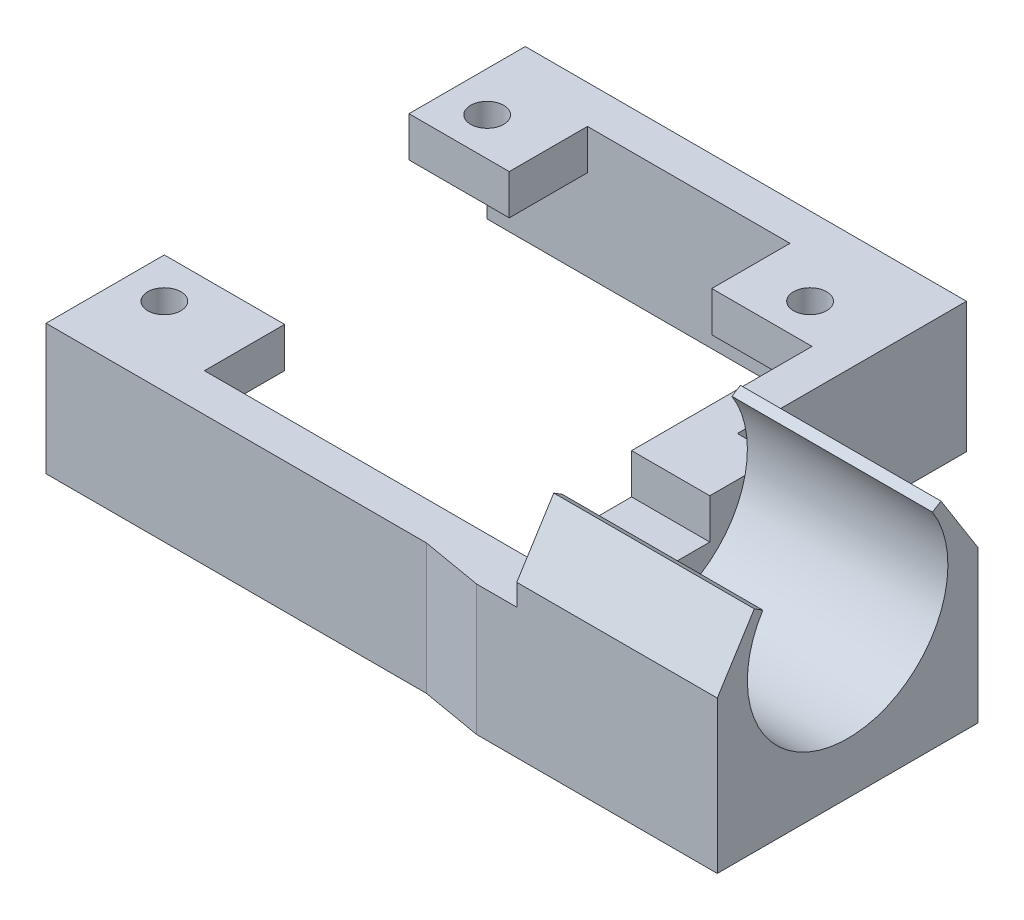
ISO-10303-21;
HEADER;
FILE_DESCRIPTION(('STEP AP214'),'2;1');
FILE_NAME('part.step','',(''),(''),'','','');
FILE_SCHEMA(('AUTOMOTIVE_DESIGN { 1 0 10303 214 1 1 1 1 }'));
ENDSEC;
DATA;
#1=APPLICATION_CONTEXT('core data for automotive mechanical design processes');
#2=APPLICATION_PROTOCOL_DEFINITION('international standard','automotive_design',2000,#1);
#3=PRODUCT_CONTEXT('',#1,'mechanical');
#4=PRODUCT('Part','Part','',(#3));
#5=PRODUCT_RELATED_PRODUCT_CATEGORY('part','',(#4));
#6=PRODUCT_DEFINITION_FORMATION('','',#4);
#7=PRODUCT_DEFINITION_CONTEXT('part definition',#1,'design');
#8=PRODUCT_DEFINITION('design','',#6,#7);
#9=PRODUCT_DEFINITION_SHAPE('','',#8);
#10=(LENGTH_UNIT() NAMED_UNIT(*) SI_UNIT(.MILLI.,.METRE.));
#11=(NAMED_UNIT(*) PLANE_ANGLE_UNIT() SI_UNIT($,.RADIAN.));
#12=(NAMED_UNIT(*) SI_UNIT($,.STERADIAN.) SOLID_ANGLE_UNIT());
#13=UNCERTAINTY_MEASURE_WITH_UNIT(LENGTH_MEASURE(1.E-05),#10,'distance_accuracy_value','');
#14=(GEOMETRIC_REPRESENTATION_CONTEXT(3) GLOBAL_UNCERTAINTY_ASSIGNED_CONTEXT((#13)) GLOBAL_UNIT_ASSIGNED_CONTEXT((#10,
#11,#12)) REPRESENTATION_CONTEXT('',''));
#15=CARTESIAN_POINT('',(0.,0.,0.));
#16=DIRECTION('',(0.,0.,1.));
#17=DIRECTION('',(1.,0.,0.));
#18=AXIS2_PLACEMENT_3D('',#15,#16,#17);
#19=CARTESIAN_POINT('',(27.9,15.15,11.95));
#20=DIRECTION('',(1.,0.,0.));
#21=DIRECTION('',(0.,0.,-1.));
#22=AXIS2_PLACEMENT_3D('',#19,#20,#21);
#23=PLANE('',#22);
#24=DIRECTION('',(0.,0.,1.));
#25=VECTOR('',#24,1.);
#26=CARTESIAN_POINT('',(27.9,9.,-1.05));
#27=LINE('',#26,#25);
#28=CARTESIAN_POINT('',(27.9,8.99999999999999,19.8352710796776));
#29=VERTEX_POINT('',#28);
#30=CARTESIAN_POINT('',(27.9,8.99999999999999,20.1));
#31=VERTEX_POINT('',#30);
#32=EDGE_CURVE('E550',#29,#31,#27,.T.);
#33=ORIENTED_EDGE('',*,*,#32,.T.);
#34=DIRECTION('',(0.,-1.,0.));
#35=VECTOR('',#34,1.);
#36=CARTESIAN_POINT('',(27.9,13.,20.1));
#37=LINE('',#36,#35);
#38=CARTESIAN_POINT('',(27.9,9.35539043593099,20.1));
#39=VERTEX_POINT('',#38);
#40=EDGE_CURVE('E337',#39,#31,#37,.T.);
#41=ORIENTED_EDGE('',*,*,#40,.F.);
#42=CARTESIAN_POINT('',(27.9,15.15,11.95));
#43=DIRECTION('',(1.,0.,0.));
#44=DIRECTION('',(0.,0.,-1.));
#45=AXIS2_PLACEMENT_3D('',#42,#43,#44);
#46=CIRCLE('',#45,10.);
#47=EDGE_CURVE('E523',#39,#29,#46,.T.);
#48=ORIENTED_EDGE('',*,*,#47,.T.);
#49=EDGE_LOOP('',(#33,#41,#48));
#50=FACE_BOUND('',#49,.T.);
#51=ADVANCED_FACE('F41',(#50),#23,.F.);
#52=CARTESIAN_POINT('',(27.9,0.,0.));
#53=DIRECTION('',(1.,0.,0.));
#54=DIRECTION('',(0.,0.,-1.));
#55=AXIS2_PLACEMENT_3D('',#52,#53,#54);
#56=PLANE('',#55);
#57=CARTESIAN_POINT('',(27.9,13.,2.18385951360518));
#58=VERTEX_POINT('',#57);
#59=EDGE_CURVE('E11',#29,#58,#46,.T.);
#60=ORIENTED_EDGE('',*,*,#59,.T.);
#61=DIRECTION('',(0.,0.,-1.));
#62=VECTOR('',#61,1.);
#63=CARTESIAN_POINT('',(27.9,13.,0.));
#64=LINE('',#63,#62);
#65=CARTESIAN_POINT('',(27.9,13.,5.70000000000001));
#66=VERTEX_POINT('',#65);
#67=EDGE_CURVE('E373',#66,#58,#64,.T.);
#68=ORIENTED_EDGE('',*,*,#67,.F.);
#69=DIRECTION('',(0.,-1.,0.));
#70=VECTOR('',#69,1.);
#71=CARTESIAN_POINT('',(27.9,13.,5.70000000000001));
#72=LINE('',#71,#70);
#73=CARTESIAN_POINT('',(27.9,9.,5.70000000000001));
#74=VERTEX_POINT('',#73);
#75=EDGE_CURVE('E435',#66,#74,#72,.T.);
#76=ORIENTED_EDGE('',*,*,#75,.T.);
#77=EDGE_CURVE('E545',#74,#29,#27,.T.);
#78=ORIENTED_EDGE('',*,*,#77,.T.);
#79=EDGE_LOOP('',(#60,#68,#76,#78));
#80=FACE_BOUND('',#79,.T.);
#81=ADVANCED_FACE('F678',(#80),#56,.T.);
#82=CARTESIAN_POINT('',(23.9,9.,-23.9));
#83=DIRECTION('',(-1.,0.,0.));
#84=DIRECTION('',(0.,0.,1.));
#85=AXIS2_PLACEMENT_3D('',#82,#83,#84);
#86=PLANE('',#85);
#87=DIRECTION('',(0.,1.,0.));
#88=VECTOR('',#87,1.);
#89=CARTESIAN_POINT('',(23.9,0.,-1.05));
#90=LINE('',#89,#88);
#91=CARTESIAN_POINT('',(23.9,0.,-1.05000000000001));
#92=VERTEX_POINT('',#91);
#93=CARTESIAN_POINT('',(23.9,13.,-1.05000000000001));
#94=VERTEX_POINT('',#93);
#95=EDGE_CURVE('E544',#92,#94,#90,.T.);
#96=ORIENTED_EDGE('',*,*,#95,.F.);
#97=DIRECTION('',(0.,0.,-1.));
#98=VECTOR('',#97,1.);
#99=CARTESIAN_POINT('',(23.9,0.,-23.9));
#100=LINE('',#99,#98);
#101=CARTESIAN_POINT('',(23.9,0.,-23.9));
#102=VERTEX_POINT('',#101);
#103=EDGE_CURVE('E591',#92,#102,#100,.T.);
#104=ORIENTED_EDGE('',*,*,#103,.T.);
#105=DIRECTION('',(0.,-1.,0.));
#106=VECTOR('',#105,1.);
#107=CARTESIAN_POINT('',(23.9,9.,-23.9));
#108=LINE('',#107,#106);
#109=CARTESIAN_POINT('',(23.9,13.,-23.9));
#110=VERTEX_POINT('',#109);
#111=EDGE_CURVE('E269',#110,#102,#108,.T.);
#112=ORIENTED_EDGE('',*,*,#111,.F.);
#113=DIRECTION('',(0.,0.,-1.));
#114=VECTOR('',#113,1.);
#115=CARTESIAN_POINT('',(23.9,13.,0.));
#116=LINE('',#115,#114);
#117=EDGE_CURVE('E381',#94,#110,#116,.T.);
#118=ORIENTED_EDGE('',*,*,#117,.F.);
#119=EDGE_LOOP('',(#96,#104,#112,#118));
#120=FACE_BOUND('',#119,.T.);
#121=ADVANCED_FACE('F685',(#120),#86,.F.);
#122=CARTESIAN_POINT('',(-20.1,9.,-20.1));
#123=DIRECTION('',(1.,0.,0.));
#124=DIRECTION('',(0.,0.,-1.));
#125=AXIS2_PLACEMENT_3D('',#122,#123,#124);
#126=PLANE('',#125);
#127=DIRECTION('',(0.,0.,1.));
#128=VECTOR('',#127,1.);
#129=CARTESIAN_POINT('',(-20.1,0.,-20.1));
#130=LINE('',#129,#128);
#131=CARTESIAN_POINT('',(-20.1,0.,-23.9));
#132=VERTEX_POINT('',#131);
#133=CARTESIAN_POINT('',(-20.1,0.,-20.1));
#134=VERTEX_POINT('',#133);
#135=EDGE_CURVE('E564',#132,#134,#130,.T.);
#136=ORIENTED_EDGE('',*,*,#135,.T.);
#137=DIRECTION('',(0.,-1.,0.));
#138=VECTOR('',#137,1.);
#139=CARTESIAN_POINT('',(-20.1,9.,-20.1));
#140=LINE('',#139,#138);
#141=CARTESIAN_POINT('',(-20.1,9.,-20.1));
#142=VERTEX_POINT('',#141);
#143=EDGE_CURVE('E45',#142,#134,#140,.T.);
#144=ORIENTED_EDGE('',*,*,#143,.F.);
#145=DIRECTION('',(0.,0.,1.));
#146=VECTOR('',#145,1.);
#147=CARTESIAN_POINT('',(-20.1,9.,0.));
#148=LINE('',#147,#146);
#149=CARTESIAN_POINT('',(-20.1,9.,-12.3));
#150=VERTEX_POINT('',#149);
#151=EDGE_CURVE('E419',#142,#150,#148,.T.);
#152=ORIENTED_EDGE('',*,*,#151,.T.);
#153=DIRECTION('',(0.,-1.,0.));
#154=VECTOR('',#153,1.);
#155=CARTESIAN_POINT('',(-20.1,13.,-12.3));
#156=LINE('',#155,#154);
#157=CARTESIAN_POINT('',(-20.1,13.,-12.3));
#158=VERTEX_POINT('',#157);
#159=EDGE_CURVE('E431',#158,#150,#156,.T.);
#160=ORIENTED_EDGE('',*,*,#159,.F.);
#161=DIRECTION('',(0.,0.,1.));
#162=VECTOR('',#161,1.);
#163=CARTESIAN_POINT('',(-20.1,13.,0.));
#164=LINE('',#163,#162);
#165=CARTESIAN_POINT('',(-20.1,13.,-23.9));
#166=VERTEX_POINT('',#165);
#167=EDGE_CURVE('E389',#166,#158,#164,.T.);
#168=ORIENTED_EDGE('',*,*,#167,.F.);
#169=DIRECTION('',(0.,-1.,0.));
#170=VECTOR('',#169,1.);
#171=CARTESIAN_POINT('',(-20.1,9.,-23.9));
#172=LINE('',#171,#170);
#173=EDGE_CURVE('E573',#166,#132,#172,.T.);
#174=ORIENTED_EDGE('',*,*,#173,.T.);
#175=EDGE_LOOP('',(#136,#144,#152,#160,#168,#174));
#176=FACE_BOUND('',#175,.T.);
#177=ADVANCED_FACE('F43',(#176),#126,.F.);
#178=CARTESIAN_POINT('',(-20.1,9.,-20.1));
#179=DIRECTION('',(0.,0.,-1.));
#180=DIRECTION('',(-1.,0.,0.));
#181=AXIS2_PLACEMENT_3D('',#178,#179,#180);
#182=PLANE('',#181);
#183=DIRECTION('',(1.,0.,0.));
#184=VECTOR('',#183,1.);
#185=CARTESIAN_POINT('',(-20.1,0.,-20.1));
#186=LINE('',#185,#184);
#187=CARTESIAN_POINT('',(20.1,0.,-20.1));
#188=VERTEX_POINT('',#187);
#189=EDGE_CURVE('E577',#134,#188,#186,.T.);
#190=ORIENTED_EDGE('',*,*,#189,.T.);
#191=DIRECTION('',(0.,-1.,0.));
#192=VECTOR('',#191,1.);
#193=CARTESIAN_POINT('',(20.1,9.,-20.1));
#194=LINE('',#193,#192);
#195=CARTESIAN_POINT('',(20.1,9.,-20.1));
#196=VERTEX_POINT('',#195);
#197=EDGE_CURVE('E607',#196,#188,#194,.T.);
#198=ORIENTED_EDGE('',*,*,#197,.F.);
#199=DIRECTION('',(1.,0.,0.));
#200=VECTOR('',#199,1.);
#201=CARTESIAN_POINT('',(-20.1,9.,-20.1));
#202=LINE('',#201,#200);
#203=CARTESIAN_POINT('',(10.1,9.,-20.1));
#204=VERTEX_POINT('',#203);
#205=EDGE_CURVE('E458',#204,#196,#202,.T.);
#206=ORIENTED_EDGE('',*,*,#205,.F.);
#207=DIRECTION('',(0.,-1.,0.));
#208=VECTOR('',#207,1.);
#209=CARTESIAN_POINT('',(10.1,13.,-20.1));
#210=LINE('',#209,#208);
#211=CARTESIAN_POINT('',(10.1,13.,-20.1));
#212=VERTEX_POINT('',#211);
#213=EDGE_CURVE('E450',#212,#204,#210,.T.);
#214=ORIENTED_EDGE('',*,*,#213,.F.);
#215=DIRECTION('',(1.,0.,0.));
#216=VECTOR('',#215,1.);
#217=CARTESIAN_POINT('',(0.,13.,-20.1));
#218=LINE('',#217,#216);
#219=CARTESIAN_POINT('',(-10.1,13.,-20.1));
#220=VERTEX_POINT('',#219);
#221=EDGE_CURVE('E354',#220,#212,#218,.T.);
#222=ORIENTED_EDGE('',*,*,#221,.F.);
#223=DIRECTION('',(0.,-1.,0.));
#224=VECTOR('',#223,1.);
#225=CARTESIAN_POINT('',(-10.1,13.,-20.1));
#226=LINE('',#225,#224);
#227=CARTESIAN_POINT('',(-10.1,9.,-20.1));
#228=VERTEX_POINT('',#227);
#229=EDGE_CURVE('E454',#220,#228,#226,.T.);
#230=ORIENTED_EDGE('',*,*,#229,.T.);
#231=DIRECTION('',(1.,0.,0.));
#232=VECTOR('',#231,1.);
#233=CARTESIAN_POINT('',(-20.1,9.,-20.1));
#234=LINE('',#233,#232);
#235=EDGE_CURVE('E565',#142,#228,#234,.T.);
#236=ORIENTED_EDGE('',*,*,#235,.F.);
#237=ORIENTED_EDGE('',*,*,#143,.T.);
#238=EDGE_LOOP('',(#190,#198,#206,#214,#222,#230,#236,#237));
#239=FACE_BOUND('',#238,.T.);
#240=ADVANCED_FACE('F617',(#239),#182,.F.);
#241=CARTESIAN_POINT('',(20.1,9.,-20.1));
#242=DIRECTION('',(1.,0.,0.));
#243=DIRECTION('',(0.,0.,-1.));
#244=AXIS2_PLACEMENT_3D('',#241,#242,#243);
#245=PLANE('',#244);
#246=DIRECTION('',(0.,0.,1.));
#247=VECTOR('',#246,1.);
#248=CARTESIAN_POINT('',(20.1,0.,-20.1));
#249=LINE('',#248,#247);
#250=CARTESIAN_POINT('',(20.1,0.,20.1));
#251=VERTEX_POINT('',#250);
#252=EDGE_CURVE('E580',#188,#251,#249,.T.);
#253=ORIENTED_EDGE('',*,*,#252,.T.);
#254=DIRECTION('',(0.,-1.,0.));
#255=VECTOR('',#254,1.);
#256=CARTESIAN_POINT('',(20.1,9.,20.1));
#257=LINE('',#256,#255);
#258=CARTESIAN_POINT('',(20.1,9.,20.1));
#259=VERTEX_POINT('',#258);
#260=EDGE_CURVE('E604',#259,#251,#257,.T.);
#261=ORIENTED_EDGE('',*,*,#260,.F.);
#262=DIRECTION('',(0.,0.,1.));
#263=VECTOR('',#262,1.);
#264=CARTESIAN_POINT('',(20.1,9.,-20.1));
#265=LINE('',#264,#263);
#266=CARTESIAN_POINT('',(20.1,9.,5.70000000000001));
#267=VERTEX_POINT('',#266);
#268=EDGE_CURVE('E568',#267,#259,#265,.T.);
#269=ORIENTED_EDGE('',*,*,#268,.F.);
#270=DIRECTION('',(0.,-1.,0.));
#271=VECTOR('',#270,1.);
#272=CARTESIAN_POINT('',(20.1,13.,5.7));
#273=LINE('',#272,#271);
#274=CARTESIAN_POINT('',(20.1,13.,5.7));
#275=VERTEX_POINT('',#274);
#276=EDGE_CURVE('E439',#275,#267,#273,.T.);
#277=ORIENTED_EDGE('',*,*,#276,.F.);
#278=DIRECTION('',(0.,0.,1.));
#279=VECTOR('',#278,1.);
#280=CARTESIAN_POINT('',(20.1,13.,0.));
#281=LINE('',#280,#279);
#282=CARTESIAN_POINT('',(20.1,13.,-12.3));
#283=VERTEX_POINT('',#282);
#284=EDGE_CURVE('E365',#283,#275,#281,.T.);
#285=ORIENTED_EDGE('',*,*,#284,.F.);
#286=DIRECTION('',(0.,-1.,0.));
#287=VECTOR('',#286,1.);
#288=CARTESIAN_POINT('',(20.1,13.,-12.3));
#289=LINE('',#288,#287);
#290=CARTESIAN_POINT('',(20.1,9.,-12.3));
#291=VERTEX_POINT('',#290);
#292=EDGE_CURVE('E443',#283,#291,#289,.T.);
#293=ORIENTED_EDGE('',*,*,#292,.T.);
#294=EDGE_CURVE('E570',#196,#291,#265,.T.);
#295=ORIENTED_EDGE('',*,*,#294,.F.);
#296=ORIENTED_EDGE('',*,*,#197,.T.);
#297=EDGE_LOOP('',(#253,#261,#269,#277,#285,#293,#295,#296));
#298=FACE_BOUND('',#297,.T.);
#299=ADVANCED_FACE('F628',(#298),#245,.F.);
#300=CARTESIAN_POINT('',(-20.1,9.,20.1));
#301=DIRECTION('',(0.,0.,1.));
#302=DIRECTION('',(1.,0.,0.));
#303=AXIS2_PLACEMENT_3D('',#300,#301,#302);
#304=PLANE('',#303);
#305=DIRECTION('',(-1.,0.,0.));
#306=VECTOR('',#305,1.);
#307=CARTESIAN_POINT('',(-20.1,0.,20.1));
#308=LINE('',#307,#306);
#309=CARTESIAN_POINT('',(-20.1,0.,20.1));
#310=VERTEX_POINT('',#309);
#311=EDGE_CURVE('E583',#251,#310,#308,.T.);
#312=ORIENTED_EDGE('',*,*,#311,.T.);
#313=DIRECTION('',(0.,-1.,0.));
#314=VECTOR('',#313,1.);
#315=CARTESIAN_POINT('',(-20.1,9.,20.1));
#316=LINE('',#315,#314);
#317=CARTESIAN_POINT('',(-20.1,9.,20.1));
#318=VERTEX_POINT('',#317);
#319=EDGE_CURVE('E268',#318,#310,#316,.T.);
#320=ORIENTED_EDGE('',*,*,#319,.F.);
#321=DIRECTION('',(-1.,0.,0.));
#322=VECTOR('',#321,1.);
#323=CARTESIAN_POINT('',(-20.1,9.,20.1));
#324=LINE('',#323,#322);
#325=CARTESIAN_POINT('',(-8.1,9.,20.1));
#326=VERTEX_POINT('',#325);
#327=EDGE_CURVE('E60',#326,#318,#324,.T.);
#328=ORIENTED_EDGE('',*,*,#327,.F.);
#329=DIRECTION('',(0.,-1.,0.));
#330=VECTOR('',#329,1.);
#331=CARTESIAN_POINT('',(-8.1,13.,20.1));
#332=LINE('',#331,#330);
#333=CARTESIAN_POINT('',(-8.1,13.,20.1));
#334=VERTEX_POINT('',#333);
#335=EDGE_CURVE('E334',#334,#326,#332,.T.);
#336=ORIENTED_EDGE('',*,*,#335,.F.);
#337=DIRECTION('',(1.,0.,0.));
#338=VECTOR('',#337,1.);
#339=CARTESIAN_POINT('',(0.,13.,20.1));
#340=LINE('',#339,#338);
#341=CARTESIAN_POINT('',(27.9,13.,20.1));
#342=VERTEX_POINT('',#341);
#343=EDGE_CURVE('E302',#334,#342,#340,.T.);
#344=ORIENTED_EDGE('',*,*,#343,.T.);
#345=EDGE_CURVE('E338',#342,#39,#37,.T.);
#346=ORIENTED_EDGE('',*,*,#345,.T.);
#347=ORIENTED_EDGE('',*,*,#40,.T.);
#348=DIRECTION('',(1.,0.,0.));
#349=VECTOR('',#348,1.);
#350=CARTESIAN_POINT('',(0.,9.,20.1));
#351=LINE('',#350,#349);
#352=EDGE_CURVE('E319',#259,#31,#351,.T.);
#353=ORIENTED_EDGE('',*,*,#352,.F.);
#354=ORIENTED_EDGE('',*,*,#260,.T.);
#355=EDGE_LOOP('',(#312,#320,#328,#336,#344,#346,#347,#353,#354));
#356=FACE_BOUND('',#355,.T.);
#357=ADVANCED_FACE('F631',(#356),#304,.F.);
#358=CARTESIAN_POINT('',(-20.1,9.,20.1));
#359=DIRECTION('',(1.,0.,0.));
#360=DIRECTION('',(0.,0.,-1.));
#361=AXIS2_PLACEMENT_3D('',#358,#359,#360);
#362=PLANE('',#361);
#363=DIRECTION('',(0.,0.,1.));
#364=VECTOR('',#363,1.);
#365=CARTESIAN_POINT('',(-20.1,0.,20.1));
#366=LINE('',#365,#364);
#367=CARTESIAN_POINT('',(-20.1,0.,23.9));
#368=VERTEX_POINT('',#367);
#369=EDGE_CURVE('E263',#310,#368,#366,.T.);
#370=ORIENTED_EDGE('',*,*,#369,.T.);
#371=DIRECTION('',(0.,-1.,0.));
#372=VECTOR('',#371,1.);
#373=CARTESIAN_POINT('',(-20.1,9.,23.9));
#374=LINE('',#373,#372);
#375=CARTESIAN_POINT('',(-20.1,13.,23.9));
#376=VERTEX_POINT('',#375);
#377=EDGE_CURVE('E254',#376,#368,#374,.T.);
#378=ORIENTED_EDGE('',*,*,#377,.F.);
#379=DIRECTION('',(0.,0.,-1.));
#380=VECTOR('',#379,1.);
#381=CARTESIAN_POINT('',(-20.1,13.,0.));
#382=LINE('',#381,#380);
#383=CARTESIAN_POINT('',(-20.1,13.,12.1));
#384=VERTEX_POINT('',#383);
#385=EDGE_CURVE('E259',#376,#384,#382,.T.);
#386=ORIENTED_EDGE('',*,*,#385,.T.);
#387=DIRECTION('',(0.,-1.,0.));
#388=VECTOR('',#387,1.);
#389=CARTESIAN_POINT('',(-20.1,13.,12.1));
#390=LINE('',#389,#388);
#391=CARTESIAN_POINT('',(-20.1,9.,12.1));
#392=VERTEX_POINT('',#391);
#393=EDGE_CURVE('E311',#384,#392,#390,.T.);
#394=ORIENTED_EDGE('',*,*,#393,.T.);
#395=DIRECTION('',(0.,0.,-1.));
#396=VECTOR('',#395,1.);
#397=CARTESIAN_POINT('',(-20.1,9.,0.));
#398=LINE('',#397,#396);
#399=EDGE_CURVE('E316',#318,#392,#398,.T.);
#400=ORIENTED_EDGE('',*,*,#399,.F.);
#401=ORIENTED_EDGE('',*,*,#319,.T.);
#402=EDGE_LOOP('',(#370,#378,#386,#394,#400,#401));
#403=FACE_BOUND('',#402,.T.);
#404=ADVANCED_FACE('F256',(#403),#362,.F.);
#405=CARTESIAN_POINT('',(-20.1,9.,23.9));
#406=DIRECTION('',(0.,0.,-1.));
#407=DIRECTION('',(-1.,0.,0.));
#408=AXIS2_PLACEMENT_3D('',#405,#406,#407);
#409=PLANE('',#408);
#410=DIRECTION('',(1.,0.,0.));
#411=VECTOR('',#410,1.);
#412=CARTESIAN_POINT('',(-20.1,0.,23.9));
#413=LINE('',#412,#411);
#414=CARTESIAN_POINT('',(17.8294064448453,0.,23.9));
#415=VERTEX_POINT('',#414);
#416=EDGE_CURVE('E588',#368,#415,#413,.T.);
#417=ORIENTED_EDGE('',*,*,#416,.T.);
#418=DIRECTION('',(0.,1.,0.));
#419=VECTOR('',#418,1.);
#420=CARTESIAN_POINT('',(17.8294064448453,-6.16073097220495,23.9));
#421=LINE('',#420,#419);
#422=CARTESIAN_POINT('',(17.8294064448453,13.,23.9));
#423=VERTEX_POINT('',#422);
#424=EDGE_CURVE('E275',#415,#423,#421,.T.);
#425=ORIENTED_EDGE('',*,*,#424,.T.);
#426=DIRECTION('',(1.,0.,0.));
#427=VECTOR('',#426,1.);
#428=CARTESIAN_POINT('',(0.,13.,23.9));
#429=LINE('',#428,#427);
#430=EDGE_CURVE('E272',#376,#423,#429,.T.);
#431=ORIENTED_EDGE('',*,*,#430,.F.);
#432=ORIENTED_EDGE('',*,*,#377,.T.);
#433=EDGE_LOOP('',(#417,#425,#431,#432));
#434=FACE_BOUND('',#433,.T.);
#435=ADVANCED_FACE('F273',(#434),#409,.F.);
#436=CARTESIAN_POINT('',(-20.1,9.,-23.9));
#437=DIRECTION('',(0.,0.,1.));
#438=DIRECTION('',(1.,0.,0.));
#439=AXIS2_PLACEMENT_3D('',#436,#437,#438);
#440=PLANE('',#439);
#441=DIRECTION('',(-1.,0.,0.));
#442=VECTOR('',#441,1.);
#443=CARTESIAN_POINT('',(-20.1,0.,-23.9));
#444=LINE('',#443,#442);
#445=EDGE_CURVE('E569',#102,#132,#444,.T.);
#446=ORIENTED_EDGE('',*,*,#445,.T.);
#447=ORIENTED_EDGE('',*,*,#173,.F.);
#448=DIRECTION('',(-1.,0.,0.));
#449=VECTOR('',#448,1.);
#450=CARTESIAN_POINT('',(0.,13.,-23.9));
#451=LINE('',#450,#449);
#452=EDGE_CURVE('E385',#110,#166,#451,.T.);
#453=ORIENTED_EDGE('',*,*,#452,.F.);
#454=ORIENTED_EDGE('',*,*,#111,.T.);
#455=EDGE_LOOP('',(#446,#447,#453,#454));
#456=FACE_BOUND('',#455,.T.);
#457=ADVANCED_FACE('F716',(#456),#440,.F.);
#458=CARTESIAN_POINT('',(0.,9.,0.));
#459=DIRECTION('',(0.,-1.,0.));
#460=DIRECTION('',(0.,0.,-1.));
#461=AXIS2_PLACEMENT_3D('',#458,#459,#460);
#462=PLANE('',#461);
#463=ORIENTED_EDGE('',*,*,#268,.T.);
#464=ORIENTED_EDGE('',*,*,#352,.T.);
#465=ORIENTED_EDGE('',*,*,#32,.F.);
#466=ORIENTED_EDGE('',*,*,#77,.F.);
#467=DIRECTION('',(-1.,0.,0.));
#468=VECTOR('',#467,1.);
#469=CARTESIAN_POINT('',(0.,9.,5.69999999999999));
#470=LINE('',#469,#468);
#471=EDGE_CURVE('E416',#74,#267,#470,.T.);
#472=ORIENTED_EDGE('',*,*,#471,.T.);
#473=EDGE_LOOP('',(#463,#464,#465,#466,#472));
#474=FACE_BOUND('',#473,.T.);
#475=ADVANCED_FACE('F636',(#474),#462,.F.);
#476=CARTESIAN_POINT('',(0.,0.,0.));
#477=DIRECTION('',(0.,-1.,0.));
#478=DIRECTION('',(0.,0.,-1.));
#479=AXIS2_PLACEMENT_3D('',#476,#477,#478);
#480=PLANE('',#479);
#481=DIRECTION('',(0.985369038599972,0.,0.170434320981914));
#482=VECTOR('',#481,1.);
#483=CARTESIAN_POINT('',(23.9,0.,24.95));
#484=LINE('',#483,#482);
#485=CARTESIAN_POINT('',(23.9,0.,24.95));
#486=VERTEX_POINT('',#485);
#487=EDGE_CURVE('E462',#415,#486,#484,.T.);
#488=ORIENTED_EDGE('',*,*,#487,.F.);
#489=ORIENTED_EDGE('',*,*,#416,.F.);
#490=ORIENTED_EDGE('',*,*,#369,.F.);
#491=ORIENTED_EDGE('',*,*,#311,.F.);
#492=ORIENTED_EDGE('',*,*,#252,.F.);
#493=ORIENTED_EDGE('',*,*,#189,.F.);
#494=ORIENTED_EDGE('',*,*,#135,.F.);
#495=ORIENTED_EDGE('',*,*,#445,.F.);
#496=ORIENTED_EDGE('',*,*,#103,.F.);
#497=DIRECTION('',(-1.,0.,0.));
#498=VECTOR('',#497,1.);
#499=CARTESIAN_POINT('',(27.9,0.,-1.05));
#500=LINE('',#499,#498);
#501=CARTESIAN_POINT('',(47.9,0.,-1.05000000000001));
#502=VERTEX_POINT('',#501);
#503=EDGE_CURVE('E549',#502,#92,#500,.T.);
#504=ORIENTED_EDGE('',*,*,#503,.F.);
#505=DIRECTION('',(0.,0.,1.));
#506=VECTOR('',#505,1.);
#507=CARTESIAN_POINT('',(47.9,0.,0.));
#508=LINE('',#507,#506);
#509=CARTESIAN_POINT('',(47.9,0.,24.95));
#510=VERTEX_POINT('',#509);
#511=EDGE_CURVE('E479',#502,#510,#508,.T.);
#512=ORIENTED_EDGE('',*,*,#511,.T.);
#513=DIRECTION('',(-1.,0.,0.));
#514=VECTOR('',#513,1.);
#515=CARTESIAN_POINT('',(27.9,0.,24.95));
#516=LINE('',#515,#514);
#517=EDGE_CURVE('E560',#510,#486,#516,.T.);
#518=ORIENTED_EDGE('',*,*,#517,.T.);
#519=EDGE_LOOP('',(#488,#489,#490,#491,#492,#493,#494,#495,#496,#504,#512,#518));
#520=FACE_BOUND('',#519,.T.);
#521=ADVANCED_FACE('F624',(#520),#480,.T.);
#522=CARTESIAN_POINT('',(27.9,0.,-1.05));
#523=DIRECTION('',(0.,0.,1.));
#524=DIRECTION('',(1.,0.,0.));
#525=AXIS2_PLACEMENT_3D('',#522,#523,#524);
#526=PLANE('',#525);
#527=ORIENTED_EDGE('',*,*,#95,.T.);
#528=DIRECTION('',(-1.,0.,0.));
#529=VECTOR('',#528,1.);
#530=CARTESIAN_POINT('',(0.,13.,-1.05));
#531=LINE('',#530,#529);
#532=CARTESIAN_POINT('',(27.9,13.,-1.05));
#533=VERTEX_POINT('',#532);
#534=EDGE_CURVE('E377',#533,#94,#531,.T.);
#535=ORIENTED_EDGE('',*,*,#534,.F.);
#536=DIRECTION('',(0.,-1.,0.));
#537=VECTOR('',#536,1.);
#538=CARTESIAN_POINT('',(27.9,0.,-1.05));
#539=LINE('',#538,#537);
#540=CARTESIAN_POINT('',(27.9,15.15,-1.05));
#541=VERTEX_POINT('',#540);
#542=EDGE_CURVE('E510',#541,#533,#539,.T.);
#543=ORIENTED_EDGE('',*,*,#542,.F.);
#544=DIRECTION('',(-1.,0.,0.));
#545=VECTOR('',#544,1.);
#546=CARTESIAN_POINT('',(47.9,15.15,-1.05));
#547=LINE('',#546,#545);
#548=CARTESIAN_POINT('',(47.9,15.15,-1.05));
#549=VERTEX_POINT('',#548);
#550=EDGE_CURVE('E533',#549,#541,#547,.T.);
#551=ORIENTED_EDGE('',*,*,#550,.F.);
#552=DIRECTION('',(0.,-1.,0.));
#553=VECTOR('',#552,1.);
#554=CARTESIAN_POINT('',(47.9,0.,-1.05000000000001));
#555=LINE('',#554,#553);
#556=EDGE_CURVE('E483',#549,#502,#555,.T.);
#557=ORIENTED_EDGE('',*,*,#556,.T.);
#558=ORIENTED_EDGE('',*,*,#503,.T.);
#559=EDGE_LOOP('',(#527,#535,#543,#551,#557,#558));
#560=FACE_BOUND('',#559,.T.);
#561=ADVANCED_FACE('F698',(#560),#526,.F.);
#562=CARTESIAN_POINT('',(27.9,0.,24.95));
#563=DIRECTION('',(0.,0.,-1.));
#564=DIRECTION('',(-1.,0.,0.));
#565=AXIS2_PLACEMENT_3D('',#562,#563,#564);
#566=PLANE('',#565);
#567=DIRECTION('',(1.,0.,0.));
#568=VECTOR('',#567,1.);
#569=CARTESIAN_POINT('',(0.,13.,24.95));
#570=LINE('',#569,#568);
#571=CARTESIAN_POINT('',(23.9,13.,24.95));
#572=VERTEX_POINT('',#571);
#573=CARTESIAN_POINT('',(27.9,13.,24.95));
#574=VERTEX_POINT('',#573);
#575=EDGE_CURVE('E295',#572,#574,#570,.T.);
#576=ORIENTED_EDGE('',*,*,#575,.F.);
#577=DIRECTION('',(0.,-1.,0.));
#578=VECTOR('',#577,1.);
#579=CARTESIAN_POINT('',(23.9,0.,24.95));
#580=LINE('',#579,#578);
#581=EDGE_CURVE('E553',#572,#486,#580,.T.);
#582=ORIENTED_EDGE('',*,*,#581,.T.);
#583=ORIENTED_EDGE('',*,*,#517,.F.);
#584=DIRECTION('',(0.,1.,0.));
#585=VECTOR('',#584,1.);
#586=CARTESIAN_POINT('',(47.9,0.,24.95));
#587=LINE('',#586,#585);
#588=CARTESIAN_POINT('',(47.9,15.15,24.95));
#589=VERTEX_POINT('',#588);
#590=EDGE_CURVE('E475',#510,#589,#587,.T.);
#591=ORIENTED_EDGE('',*,*,#590,.T.);
#592=DIRECTION('',(-1.,0.,0.));
#593=VECTOR('',#592,1.);
#594=CARTESIAN_POINT('',(47.9,15.15,24.95));
#595=LINE('',#594,#593);
#596=CARTESIAN_POINT('',(27.9,15.15,24.95));
#597=VERTEX_POINT('',#596);
#598=EDGE_CURVE('E536',#589,#597,#595,.T.);
#599=ORIENTED_EDGE('',*,*,#598,.T.);
#600=DIRECTION('',(0.,1.,0.));
#601=VECTOR('',#600,1.);
#602=CARTESIAN_POINT('',(27.9,0.,24.95));
#603=LINE('',#602,#601);
#604=EDGE_CURVE('E507',#574,#597,#603,.T.);
#605=ORIENTED_EDGE('',*,*,#604,.F.);
#606=EDGE_LOOP('',(#576,#582,#583,#591,#599,#605));
#607=FACE_BOUND('',#606,.T.);
#608=ADVANCED_FACE('F693',(#607),#566,.F.);
#609=ORIENTED_EDGE('',*,*,#542,.T.);
#610=EDGE_CURVE('E372',#58,#533,#64,.T.);
#611=ORIENTED_EDGE('',*,*,#610,.F.);
#612=CARTESIAN_POINT('',(27.9,20.4793871002119,3.48846153846154));
#613=VERTEX_POINT('',#612);
#614=EDGE_CURVE('E53',#58,#613,#46,.T.);
#615=ORIENTED_EDGE('',*,*,#614,.T.);
#616=DIRECTION('',(0.,0.532938710021195,-0.846153846153845));
#617=VECTOR('',#616,1.);
#618=CARTESIAN_POINT('',(27.9,16.2358716841403,10.2259471498545));
#619=LINE('',#618,#617);
#620=CARTESIAN_POINT('',(27.9,21.0123258102331,2.64230769230769));
#621=VERTEX_POINT('',#620);
#622=EDGE_CURVE('E517',#613,#621,#619,.T.);
#623=ORIENTED_EDGE('',*,*,#622,.T.);
#624=DIRECTION('',(0.,-0.846153846153846,-0.532938710021193));
#625=VECTOR('',#624,1.);
#626=CARTESIAN_POINT('',(27.9,4.7764541260928,-7.58363945754683));
#627=LINE('',#626,#625);
#628=EDGE_CURVE('E513',#621,#541,#627,.T.);
#629=ORIENTED_EDGE('',*,*,#628,.T.);
#630=EDGE_LOOP('',(#609,#611,#615,#623,#629));
#631=FACE_BOUND('',#630,.T.);
#632=ADVANCED_FACE('F681',(#631),#23,.F.);
#633=CARTESIAN_POINT('',(27.9,20.4793871002119,20.4115384615385));
#634=VERTEX_POINT('',#633);
#635=CARTESIAN_POINT('',(27.9,13.,21.7161404863948));
#636=VERTEX_POINT('',#635);
#637=EDGE_CURVE('E52',#634,#636,#46,.T.);
#638=ORIENTED_EDGE('',*,*,#637,.T.);
#639=DIRECTION('',(0.,0.,-1.));
#640=VECTOR('',#639,1.);
#641=CARTESIAN_POINT('',(27.9,13.,0.));
#642=LINE('',#641,#640);
#643=EDGE_CURVE('E68',#574,#636,#642,.T.);
#644=ORIENTED_EDGE('',*,*,#643,.F.);
#645=ORIENTED_EDGE('',*,*,#604,.T.);
#646=DIRECTION('',(0.,-0.846153846153846,0.532938710021193));
#647=VECTOR('',#646,1.);
#648=CARTESIAN_POINT('',(27.9,15.5541146541368,24.6954737770735));
#649=LINE('',#648,#647);
#650=CARTESIAN_POINT('',(27.9,21.0123258102331,21.2576923076923));
#651=VERTEX_POINT('',#650);
#652=EDGE_CURVE('E503',#651,#597,#649,.T.);
#653=ORIENTED_EDGE('',*,*,#652,.F.);
#654=DIRECTION('',(0.,0.532938710021195,0.846153846153845));
#655=VECTOR('',#654,1.);
#656=CARTESIAN_POINT('',(27.9,5.45821115609628,-3.43778146938112));
#657=LINE('',#656,#655);
#658=EDGE_CURVE('E465',#634,#651,#657,.T.);
#659=ORIENTED_EDGE('',*,*,#658,.F.);
#660=EDGE_LOOP('',(#638,#644,#645,#653,#659));
#661=FACE_BOUND('',#660,.T.);
#662=ADVANCED_FACE('F680',(#661),#23,.F.);
#663=CARTESIAN_POINT('',(47.9,5.45821115609628,-3.43778146938112));
#664=DIRECTION('',(0.,-0.846153846153845,0.532938710021195));
#665=DIRECTION('',(0.,-0.532938710021195,-0.846153846153845));
#666=AXIS2_PLACEMENT_3D('',#663,#664,#665);
#667=PLANE('',#666);
#668=ORIENTED_EDGE('',*,*,#658,.T.);
#669=DIRECTION('',(-1.,0.,0.));
#670=VECTOR('',#669,1.);
#671=CARTESIAN_POINT('',(47.9,21.0123258102331,21.2576923076923));
#672=LINE('',#671,#670);
#673=CARTESIAN_POINT('',(47.9,21.0123258102331,21.2576923076923));
#674=VERTEX_POINT('',#673);
#675=EDGE_CURVE('E540',#674,#651,#672,.T.);
#676=ORIENTED_EDGE('',*,*,#675,.F.);
#677=DIRECTION('',(0.,0.532938710021195,0.846153846153845));
#678=VECTOR('',#677,1.);
#679=CARTESIAN_POINT('',(47.9,5.45821115609628,-3.43778146938112));
#680=LINE('',#679,#678);
#681=CARTESIAN_POINT('',(47.9,20.4793871002119,20.4115384615385));
#682=VERTEX_POINT('',#681);
#683=EDGE_CURVE('E468',#682,#674,#680,.T.);
#684=ORIENTED_EDGE('',*,*,#683,.F.);
#685=DIRECTION('',(-1.,0.,0.));
#686=VECTOR('',#685,1.);
#687=CARTESIAN_POINT('',(47.9,20.4793871002119,20.4115384615385));
#688=LINE('',#687,#686);
#689=EDGE_CURVE('E499',#682,#634,#688,.T.);
#690=ORIENTED_EDGE('',*,*,#689,.T.);
#691=EDGE_LOOP('',(#668,#676,#684,#690));
#692=FACE_BOUND('',#691,.T.);
#693=ADVANCED_FACE('F691',(#692),#667,.F.);
#694=CARTESIAN_POINT('',(47.9,15.5541146541368,24.6954737770734));
#695=DIRECTION('',(0.,-0.532938710021193,-0.846153846153846));
#696=DIRECTION('',(0.,0.846153846153846,-0.532938710021193));
#697=AXIS2_PLACEMENT_3D('',#694,#695,#696);
#698=PLANE('',#697);
#699=ORIENTED_EDGE('',*,*,#652,.T.);
#700=ORIENTED_EDGE('',*,*,#598,.F.);
#701=DIRECTION('',(0.,-0.846153846153846,0.532938710021193));
#702=VECTOR('',#701,1.);
#703=CARTESIAN_POINT('',(47.9,15.5541146541368,24.6954737770734));
#704=LINE('',#703,#702);
#705=EDGE_CURVE('E472',#674,#589,#704,.T.);
#706=ORIENTED_EDGE('',*,*,#705,.F.);
#707=ORIENTED_EDGE('',*,*,#675,.T.);
#708=EDGE_LOOP('',(#699,#700,#706,#707));
#709=FACE_BOUND('',#708,.T.);
#710=ADVANCED_FACE('F1078',(#709),#698,.F.);
#711=CARTESIAN_POINT('',(47.9,4.7764541260928,-7.58363945754683));
#712=DIRECTION('',(0.,0.532938710021193,-0.846153846153846));
#713=DIRECTION('',(0.,0.846153846153846,0.532938710021193));
#714=AXIS2_PLACEMENT_3D('',#711,#712,#713);
#715=PLANE('',#714);
#716=ORIENTED_EDGE('',*,*,#628,.F.);
#717=DIRECTION('',(-1.,0.,0.));
#718=VECTOR('',#717,1.);
#719=CARTESIAN_POINT('',(47.9,21.0123258102331,2.64230769230769));
#720=LINE('',#719,#718);
#721=CARTESIAN_POINT('',(47.9,21.0123258102331,2.64230769230769));
#722=VERTEX_POINT('',#721);
#723=EDGE_CURVE('E530',#722,#621,#720,.T.);
#724=ORIENTED_EDGE('',*,*,#723,.F.);
#725=DIRECTION('',(0.,-0.846153846153846,-0.532938710021193));
#726=VECTOR('',#725,1.);
#727=CARTESIAN_POINT('',(47.9,4.7764541260928,-7.58363945754683));
#728=LINE('',#727,#726);
#729=EDGE_CURVE('E487',#722,#549,#728,.T.);
#730=ORIENTED_EDGE('',*,*,#729,.T.);
#731=ORIENTED_EDGE('',*,*,#550,.T.);
#732=EDGE_LOOP('',(#716,#724,#730,#731));
#733=FACE_BOUND('',#732,.T.);
#734=ADVANCED_FACE('F750',(#733),#715,.T.);
#735=CARTESIAN_POINT('',(47.9,16.2358716841403,10.2259471498545));
#736=DIRECTION('',(0.,0.846153846153845,0.532938710021195));
#737=DIRECTION('',(0.,-0.532938710021195,0.846153846153845));
#738=AXIS2_PLACEMENT_3D('',#735,#736,#737);
#739=PLANE('',#738);
#740=ORIENTED_EDGE('',*,*,#622,.F.);
#741=DIRECTION('',(-1.,0.,0.));
#742=VECTOR('',#741,1.);
#743=CARTESIAN_POINT('',(47.9,20.4793871002119,3.48846153846154));
#744=LINE('',#743,#742);
#745=CARTESIAN_POINT('',(47.9,20.4793871002119,3.48846153846154));
#746=VERTEX_POINT('',#745);
#747=EDGE_CURVE('E526',#746,#613,#744,.T.);
#748=ORIENTED_EDGE('',*,*,#747,.F.);
#749=DIRECTION('',(0.,0.532938710021195,-0.846153846153845));
#750=VECTOR('',#749,1.);
#751=CARTESIAN_POINT('',(47.9,16.2358716841403,10.2259471498545));
#752=LINE('',#751,#750);
#753=EDGE_CURVE('E491',#746,#722,#752,.T.);
#754=ORIENTED_EDGE('',*,*,#753,.T.);
#755=ORIENTED_EDGE('',*,*,#723,.T.);
#756=EDGE_LOOP('',(#740,#748,#754,#755));
#757=FACE_BOUND('',#756,.T.);
#758=ADVANCED_FACE('F746',(#757),#739,.T.);
#759=CARTESIAN_POINT('',(47.9,15.15,11.95));
#760=DIRECTION('',(-1.,0.,0.));
#761=DIRECTION('',(0.,0.,1.));
#762=AXIS2_PLACEMENT_3D('',#759,#760,#761);
#763=CYLINDRICAL_SURFACE('',#762,10.);
#764=ORIENTED_EDGE('',*,*,#637,.F.);
#765=ORIENTED_EDGE('',*,*,#689,.F.);
#766=CARTESIAN_POINT('',(47.9,15.15,11.95));
#767=DIRECTION('',(1.,0.,0.));
#768=DIRECTION('',(0.,0.,-1.));
#769=AXIS2_PLACEMENT_3D('',#766,#767,#768);
#770=CIRCLE('',#769,10.);
#771=EDGE_CURVE('E495',#682,#746,#770,.T.);
#772=ORIENTED_EDGE('',*,*,#771,.T.);
#773=ORIENTED_EDGE('',*,*,#747,.T.);
#774=ORIENTED_EDGE('',*,*,#614,.F.);
#775=ORIENTED_EDGE('',*,*,#59,.F.);
#776=ORIENTED_EDGE('',*,*,#47,.F.);
#777=EDGE_CURVE('E522',#636,#39,#46,.T.);
#778=ORIENTED_EDGE('',*,*,#777,.F.);
#779=EDGE_LOOP('',(#764,#765,#772,#773,#774,#775,#776,#778));
#780=FACE_BOUND('',#779,.T.);
#781=ADVANCED_FACE('F743',(#780),#763,.F.);
#782=CARTESIAN_POINT('',(47.9,15.15,11.95));
#783=DIRECTION('',(1.,0.,0.));
#784=DIRECTION('',(0.,0.,-1.));
#785=AXIS2_PLACEMENT_3D('',#782,#783,#784);
#786=PLANE('',#785);
#787=ORIENTED_EDGE('',*,*,#683,.T.);
#788=ORIENTED_EDGE('',*,*,#705,.T.);
#789=ORIENTED_EDGE('',*,*,#590,.F.);
#790=ORIENTED_EDGE('',*,*,#511,.F.);
#791=ORIENTED_EDGE('',*,*,#556,.F.);
#792=ORIENTED_EDGE('',*,*,#729,.F.);
#793=ORIENTED_EDGE('',*,*,#753,.F.);
#794=ORIENTED_EDGE('',*,*,#771,.F.);
#795=EDGE_LOOP('',(#787,#788,#789,#790,#791,#792,#793,#794));
#796=FACE_BOUND('',#795,.T.);
#797=ADVANCED_FACE('F754',(#796),#786,.T.);
#798=CARTESIAN_POINT('',(23.9,-6.16073097220495,24.95));
#799=DIRECTION('',(-0.170434320981914,0.,0.985369038599972));
#800=DIRECTION('',(0.985369038599972,0.,0.170434320981914));
#801=AXIS2_PLACEMENT_3D('',#798,#799,#800);
#802=PLANE('',#801);
#803=ORIENTED_EDGE('',*,*,#424,.F.);
#804=ORIENTED_EDGE('',*,*,#487,.T.);
#805=ORIENTED_EDGE('',*,*,#581,.F.);
#806=DIRECTION('',(0.985369038599972,0.,0.170434320981914));
#807=VECTOR('',#806,1.);
#808=CARTESIAN_POINT('',(-3.49587673944045,13.,20.211473146726));
#809=LINE('',#808,#807);
#810=EDGE_CURVE('E280',#423,#572,#809,.T.);
#811=ORIENTED_EDGE('',*,*,#810,.F.);
#812=EDGE_LOOP('',(#803,#804,#805,#811));
#813=FACE_BOUND('',#812,.T.);
#814=ADVANCED_FACE('F758',(#813),#802,.T.);
#815=CARTESIAN_POINT('',(0.,9.,0.));
#816=DIRECTION('',(0.,1.,0.));
#817=DIRECTION('',(0.,0.,1.));
#818=AXIS2_PLACEMENT_3D('',#815,#816,#817);
#819=PLANE('',#818);
#820=CARTESIAN_POINT('',(-16.1,9.,-16.1));
#821=DIRECTION('',(0.,1.,0.));
#822=DIRECTION('',(0.,0.,1.));
#823=AXIS2_PLACEMENT_3D('',#820,#821,#822);
#824=CIRCLE('',#823,1.65);
#825=CARTESIAN_POINT('',(-16.1,9.,-14.45));
#826=VERTEX_POINT('',#825);
#827=EDGE_CURVE('E344',#826,#826,#824,.T.);
#828=ORIENTED_EDGE('',*,*,#827,.T.);
#829=EDGE_LOOP('',(#828));
#830=FACE_BOUND('',#829,.T.);
#831=ORIENTED_EDGE('',*,*,#151,.F.);
#832=ORIENTED_EDGE('',*,*,#235,.T.);
#833=DIRECTION('',(0.,0.,1.));
#834=VECTOR('',#833,1.);
#835=CARTESIAN_POINT('',(-10.1,9.,0.));
#836=LINE('',#835,#834);
#837=CARTESIAN_POINT('',(-10.1,9.,-12.3));
#838=VERTEX_POINT('',#837);
#839=EDGE_CURVE('E404',#228,#838,#836,.T.);
#840=ORIENTED_EDGE('',*,*,#839,.T.);
#841=DIRECTION('',(1.,0.,0.));
#842=VECTOR('',#841,1.);
#843=CARTESIAN_POINT('',(0.,9.,-12.3));
#844=LINE('',#843,#842);
#845=EDGE_CURVE('E422',#150,#838,#844,.T.);
#846=ORIENTED_EDGE('',*,*,#845,.F.);
#847=EDGE_LOOP('',(#831,#832,#840,#846));
#848=FACE_BOUND('',#847,.T.);
#849=ADVANCED_FACE('F760',(#830,#848),#819,.F.);
#850=CARTESIAN_POINT('',(16.1,9.,-16.1));
#851=DIRECTION('',(0.,1.,0.));
#852=DIRECTION('',(0.,0.,1.));
#853=AXIS2_PLACEMENT_3D('',#850,#851,#852);
#854=CIRCLE('',#853,1.65);
#855=CARTESIAN_POINT('',(16.1,9.,-14.45));
#856=VERTEX_POINT('',#855);
#857=EDGE_CURVE('E350',#856,#856,#854,.T.);
#858=ORIENTED_EDGE('',*,*,#857,.T.);
#859=EDGE_LOOP('',(#858));
#860=FACE_BOUND('',#859,.T.);
#861=DIRECTION('',(0.,0.,1.));
#862=VECTOR('',#861,1.);
#863=CARTESIAN_POINT('',(10.1,9.,0.));
#864=LINE('',#863,#862);
#865=CARTESIAN_POINT('',(10.1,9.,-12.3));
#866=VERTEX_POINT('',#865);
#867=EDGE_CURVE('E408',#204,#866,#864,.T.);
#868=ORIENTED_EDGE('',*,*,#867,.F.);
#869=ORIENTED_EDGE('',*,*,#205,.T.);
#870=ORIENTED_EDGE('',*,*,#294,.T.);
#871=DIRECTION('',(-1.,0.,0.));
#872=VECTOR('',#871,1.);
#873=CARTESIAN_POINT('',(0.,9.,-12.3));
#874=LINE('',#873,#872);
#875=EDGE_CURVE('E412',#291,#866,#874,.T.);
#876=ORIENTED_EDGE('',*,*,#875,.T.);
#877=EDGE_LOOP('',(#868,#869,#870,#876));
#878=FACE_BOUND('',#877,.T.);
#879=ADVANCED_FACE('F766',(#860,#878),#819,.F.);
#880=CARTESIAN_POINT('',(-10.1,13.,0.));
#881=DIRECTION('',(1.,0.,0.));
#882=DIRECTION('',(0.,0.,-1.));
#883=AXIS2_PLACEMENT_3D('',#880,#881,#882);
#884=PLANE('',#883);
#885=ORIENTED_EDGE('',*,*,#839,.F.);
#886=ORIENTED_EDGE('',*,*,#229,.F.);
#887=DIRECTION('',(0.,0.,1.));
#888=VECTOR('',#887,1.);
#889=CARTESIAN_POINT('',(-10.1,13.,0.));
#890=LINE('',#889,#888);
#891=CARTESIAN_POINT('',(-10.1,13.,-12.3));
#892=VERTEX_POINT('',#891);
#893=EDGE_CURVE('E349',#220,#892,#890,.T.);
#894=ORIENTED_EDGE('',*,*,#893,.T.);
#895=DIRECTION('',(0.,-1.,0.));
#896=VECTOR('',#895,1.);
#897=CARTESIAN_POINT('',(-10.1,13.,-12.3));
#898=LINE('',#897,#896);
#899=EDGE_CURVE('E400',#892,#838,#898,.T.);
#900=ORIENTED_EDGE('',*,*,#899,.T.);
#901=EDGE_LOOP('',(#885,#886,#894,#900));
#902=FACE_BOUND('',#901,.T.);
#903=ADVANCED_FACE('F725',(#902),#884,.T.);
#904=CARTESIAN_POINT('',(10.1,13.,0.));
#905=DIRECTION('',(1.,0.,0.));
#906=DIRECTION('',(0.,0.,-1.));
#907=AXIS2_PLACEMENT_3D('',#904,#905,#906);
#908=PLANE('',#907);
#909=ORIENTED_EDGE('',*,*,#867,.T.);
#910=DIRECTION('',(0.,-1.,0.));
#911=VECTOR('',#910,1.);
#912=CARTESIAN_POINT('',(10.1,13.,-12.3));
#913=LINE('',#912,#911);
#914=CARTESIAN_POINT('',(10.1,13.,-12.3));
#915=VERTEX_POINT('',#914);
#916=EDGE_CURVE('E447',#915,#866,#913,.T.);
#917=ORIENTED_EDGE('',*,*,#916,.F.);
#918=DIRECTION('',(0.,0.,1.));
#919=VECTOR('',#918,1.);
#920=CARTESIAN_POINT('',(10.1,13.,0.));
#921=LINE('',#920,#919);
#922=EDGE_CURVE('E358',#212,#915,#921,.T.);
#923=ORIENTED_EDGE('',*,*,#922,.F.);
#924=ORIENTED_EDGE('',*,*,#213,.T.);
#925=EDGE_LOOP('',(#909,#917,#923,#924));
#926=FACE_BOUND('',#925,.T.);
#927=ADVANCED_FACE('F728',(#926),#908,.F.);
#928=CARTESIAN_POINT('',(0.,13.,-12.3));
#929=DIRECTION('',(0.,0.,1.));
#930=DIRECTION('',(1.,0.,0.));
#931=AXIS2_PLACEMENT_3D('',#928,#929,#930);
#932=PLANE('',#931);
#933=ORIENTED_EDGE('',*,*,#875,.F.);
#934=ORIENTED_EDGE('',*,*,#292,.F.);
#935=DIRECTION('',(-1.,0.,0.));
#936=VECTOR('',#935,1.);
#937=CARTESIAN_POINT('',(0.,13.,-12.3));
#938=LINE('',#937,#936);
#939=EDGE_CURVE('E361',#283,#915,#938,.T.);
#940=ORIENTED_EDGE('',*,*,#939,.T.);
#941=ORIENTED_EDGE('',*,*,#916,.T.);
#942=EDGE_LOOP('',(#933,#934,#940,#941));
#943=FACE_BOUND('',#942,.T.);
#944=ADVANCED_FACE('F735',(#943),#932,.T.);
#945=CARTESIAN_POINT('',(0.,13.,5.69999999999999));
#946=DIRECTION('',(0.,0.,1.));
#947=DIRECTION('',(1.,0.,0.));
#948=AXIS2_PLACEMENT_3D('',#945,#946,#947);
#949=PLANE('',#948);
#950=ORIENTED_EDGE('',*,*,#471,.F.);
#951=ORIENTED_EDGE('',*,*,#75,.F.);
#952=DIRECTION('',(-1.,0.,0.));
#953=VECTOR('',#952,1.);
#954=CARTESIAN_POINT('',(0.,13.,5.69999999999999));
#955=LINE('',#954,#953);
#956=EDGE_CURVE('E368',#66,#275,#955,.T.);
#957=ORIENTED_EDGE('',*,*,#956,.T.);
#958=ORIENTED_EDGE('',*,*,#276,.T.);
#959=EDGE_LOOP('',(#950,#951,#957,#958));
#960=FACE_BOUND('',#959,.T.);
#961=ADVANCED_FACE('F738',(#960),#949,.T.);
#962=CARTESIAN_POINT('',(0.,13.,-12.3));
#963=DIRECTION('',(0.,0.,-1.));
#964=DIRECTION('',(-1.,0.,0.));
#965=AXIS2_PLACEMENT_3D('',#962,#963,#964);
#966=PLANE('',#965);
#967=ORIENTED_EDGE('',*,*,#845,.T.);
#968=ORIENTED_EDGE('',*,*,#899,.F.);
#969=DIRECTION('',(1.,0.,0.));
#970=VECTOR('',#969,1.);
#971=CARTESIAN_POINT('',(0.,13.,-12.3));
#972=LINE('',#971,#970);
#973=EDGE_CURVE('E393',#158,#892,#972,.T.);
#974=ORIENTED_EDGE('',*,*,#973,.F.);
#975=ORIENTED_EDGE('',*,*,#159,.T.);
#976=EDGE_LOOP('',(#967,#968,#974,#975));
#977=FACE_BOUND('',#976,.T.);
#978=ADVANCED_FACE('F719',(#977),#966,.F.);
#979=CARTESIAN_POINT('',(-16.1,13.,-16.1));
#980=DIRECTION('',(0.,-1.,0.));
#981=DIRECTION('',(0.,0.,-1.));
#982=AXIS2_PLACEMENT_3D('',#979,#980,#981);
#983=CYLINDRICAL_SURFACE('',#982,1.65);
#984=CARTESIAN_POINT('',(-16.1,13.,-16.1));
#985=DIRECTION('',(0.,1.,0.));
#986=DIRECTION('',(0.,0.,1.));
#987=AXIS2_PLACEMENT_3D('',#984,#985,#986);
#988=CIRCLE('',#987,1.65);
#989=CARTESIAN_POINT('',(-16.1,13.,-14.45));
#990=VERTEX_POINT('',#989);
#991=EDGE_CURVE('E345',#990,#990,#988,.T.);
#992=ORIENTED_EDGE('',*,*,#991,.T.);
#993=EDGE_LOOP('',(#992));
#994=FACE_BOUND('',#993,.T.);
#995=ORIENTED_EDGE('',*,*,#827,.F.);
#996=EDGE_LOOP('',(#995));
#997=FACE_BOUND('',#996,.T.);
#998=ADVANCED_FACE('F770',(#994,#997),#983,.F.);
#999=CARTESIAN_POINT('',(16.1,13.,-16.1));
#1000=DIRECTION('',(0.,-1.,0.));
#1001=DIRECTION('',(0.,0.,-1.));
#1002=AXIS2_PLACEMENT_3D('',#999,#1000,#1001);
#1003=CYLINDRICAL_SURFACE('',#1002,1.65);
#1004=CARTESIAN_POINT('',(16.1,13.,-16.1));
#1005=DIRECTION('',(0.,1.,0.));
#1006=DIRECTION('',(0.,0.,1.));
#1007=AXIS2_PLACEMENT_3D('',#1004,#1005,#1006);
#1008=CIRCLE('',#1007,1.65);
#1009=CARTESIAN_POINT('',(16.1,13.,-14.45));
#1010=VERTEX_POINT('',#1009);
#1011=EDGE_CURVE('E396',#1010,#1010,#1008,.T.);
#1012=ORIENTED_EDGE('',*,*,#1011,.T.);
#1013=EDGE_LOOP('',(#1012));
#1014=FACE_BOUND('',#1013,.T.);
#1015=ORIENTED_EDGE('',*,*,#857,.F.);
#1016=EDGE_LOOP('',(#1015));
#1017=FACE_BOUND('',#1016,.T.);
#1018=ADVANCED_FACE('F773',(#1014,#1017),#1003,.F.);
#1019=CARTESIAN_POINT('',(0.,13.,0.));
#1020=DIRECTION('',(0.,1.,0.));
#1021=DIRECTION('',(0.,0.,1.));
#1022=AXIS2_PLACEMENT_3D('',#1019,#1020,#1021);
#1023=PLANE('',#1022);
#1024=ORIENTED_EDGE('',*,*,#991,.F.);
#1025=EDGE_LOOP('',(#1024));
#1026=FACE_BOUND('',#1025,.T.);
#1027=ORIENTED_EDGE('',*,*,#893,.F.);
#1028=ORIENTED_EDGE('',*,*,#221,.T.);
#1029=ORIENTED_EDGE('',*,*,#922,.T.);
#1030=ORIENTED_EDGE('',*,*,#939,.F.);
#1031=ORIENTED_EDGE('',*,*,#284,.T.);
#1032=ORIENTED_EDGE('',*,*,#956,.F.);
#1033=ORIENTED_EDGE('',*,*,#67,.T.);
#1034=ORIENTED_EDGE('',*,*,#610,.T.);
#1035=ORIENTED_EDGE('',*,*,#534,.T.);
#1036=ORIENTED_EDGE('',*,*,#117,.T.);
#1037=ORIENTED_EDGE('',*,*,#452,.T.);
#1038=ORIENTED_EDGE('',*,*,#167,.T.);
#1039=ORIENTED_EDGE('',*,*,#973,.T.);
#1040=EDGE_LOOP('',(#1027,#1028,#1029,#1030,#1031,#1032,#1033,#1034,#1035,#1036,#1037,#1038,#1039));
#1041=FACE_BOUND('',#1040,.T.);
#1042=ORIENTED_EDGE('',*,*,#1011,.F.);
#1043=EDGE_LOOP('',(#1042));
#1044=FACE_BOUND('',#1043,.T.);
#1045=ADVANCED_FACE('F673',(#1026,#1041,#1044),#1023,.T.);
#1046=CARTESIAN_POINT('',(27.9,13.,0.));
#1047=DIRECTION('',(-1.,0.,0.));
#1048=DIRECTION('',(0.,0.,1.));
#1049=AXIS2_PLACEMENT_3D('',#1046,#1047,#1048);
#1050=PLANE('',#1049);
#1051=ORIENTED_EDGE('',*,*,#777,.T.);
#1052=ORIENTED_EDGE('',*,*,#345,.F.);
#1053=EDGE_CURVE('E299',#636,#342,#642,.T.);
#1054=ORIENTED_EDGE('',*,*,#1053,.F.);
#1055=EDGE_LOOP('',(#1051,#1052,#1054));
#1056=FACE_BOUND('',#1055,.T.);
#1057=ADVANCED_FACE('F652',(#1056),#1050,.F.);
#1058=CARTESIAN_POINT('',(0.,9.,0.));
#1059=DIRECTION('',(0.,1.,0.));
#1060=DIRECTION('',(0.,0.,1.));
#1061=AXIS2_PLACEMENT_3D('',#1058,#1059,#1060);
#1062=PLANE('',#1061);
#1063=CARTESIAN_POINT('',(-16.1,9.,16.1));
#1064=DIRECTION('',(0.,1.,0.));
#1065=DIRECTION('',(0.,0.,1.));
#1066=AXIS2_PLACEMENT_3D('',#1063,#1064,#1065);
#1067=CIRCLE('',#1066,1.65);
#1068=CARTESIAN_POINT('',(-16.1,9.,17.75));
#1069=VERTEX_POINT('',#1068);
#1070=EDGE_CURVE('E312',#1069,#1069,#1067,.T.);
#1071=ORIENTED_EDGE('',*,*,#1070,.T.);
#1072=EDGE_LOOP('',(#1071));
#1073=FACE_BOUND('',#1072,.T.);
#1074=DIRECTION('',(0.,0.,-1.));
#1075=VECTOR('',#1074,1.);
#1076=CARTESIAN_POINT('',(-8.1,9.,0.));
#1077=LINE('',#1076,#1075);
#1078=CARTESIAN_POINT('',(-8.1,9.,12.1));
#1079=VERTEX_POINT('',#1078);
#1080=EDGE_CURVE('E322',#326,#1079,#1077,.T.);
#1081=ORIENTED_EDGE('',*,*,#1080,.F.);
#1082=ORIENTED_EDGE('',*,*,#327,.T.);
#1083=ORIENTED_EDGE('',*,*,#399,.T.);
#1084=DIRECTION('',(1.,0.,0.));
#1085=VECTOR('',#1084,1.);
#1086=CARTESIAN_POINT('',(0.,9.,12.1));
#1087=LINE('',#1086,#1085);
#1088=EDGE_CURVE('E290',#392,#1079,#1087,.T.);
#1089=ORIENTED_EDGE('',*,*,#1088,.T.);
#1090=EDGE_LOOP('',(#1081,#1082,#1083,#1089));
#1091=FACE_BOUND('',#1090,.T.);
#1092=ADVANCED_FACE('F663',(#1073,#1091),#1062,.F.);
#1093=CARTESIAN_POINT('',(-8.1,13.,0.));
#1094=DIRECTION('',(-1.,0.,0.));
#1095=DIRECTION('',(0.,0.,1.));
#1096=AXIS2_PLACEMENT_3D('',#1093,#1094,#1095);
#1097=PLANE('',#1096);
#1098=ORIENTED_EDGE('',*,*,#1080,.T.);
#1099=DIRECTION('',(0.,-1.,0.));
#1100=VECTOR('',#1099,1.);
#1101=CARTESIAN_POINT('',(-8.1,13.,12.1));
#1102=LINE('',#1101,#1100);
#1103=CARTESIAN_POINT('',(-8.1,13.,12.1));
#1104=VERTEX_POINT('',#1103);
#1105=EDGE_CURVE('E331',#1104,#1079,#1102,.T.);
#1106=ORIENTED_EDGE('',*,*,#1105,.F.);
#1107=DIRECTION('',(0.,0.,-1.));
#1108=VECTOR('',#1107,1.);
#1109=CARTESIAN_POINT('',(-8.1,13.,0.));
#1110=LINE('',#1109,#1108);
#1111=EDGE_CURVE('E306',#334,#1104,#1110,.T.);
#1112=ORIENTED_EDGE('',*,*,#1111,.F.);
#1113=ORIENTED_EDGE('',*,*,#335,.T.);
#1114=EDGE_LOOP('',(#1098,#1106,#1112,#1113));
#1115=FACE_BOUND('',#1114,.T.);
#1116=ADVANCED_FACE('F657',(#1115),#1097,.F.);
#1117=CARTESIAN_POINT('',(-16.1,13.,16.1));
#1118=DIRECTION('',(0.,-1.,0.));
#1119=DIRECTION('',(0.,0.,-1.));
#1120=AXIS2_PLACEMENT_3D('',#1117,#1118,#1119);
#1121=CYLINDRICAL_SURFACE('',#1120,1.65);
#1122=CARTESIAN_POINT('',(-16.1,13.,16.1));
#1123=DIRECTION('',(0.,1.,0.));
#1124=DIRECTION('',(0.,0.,1.));
#1125=AXIS2_PLACEMENT_3D('',#1122,#1123,#1124);
#1126=CIRCLE('',#1125,1.65);
#1127=CARTESIAN_POINT('',(-16.1,13.,17.75));
#1128=VERTEX_POINT('',#1127);
#1129=EDGE_CURVE('E286',#1128,#1128,#1126,.T.);
#1130=ORIENTED_EDGE('',*,*,#1129,.T.);
#1131=EDGE_LOOP('',(#1130));
#1132=FACE_BOUND('',#1131,.T.);
#1133=ORIENTED_EDGE('',*,*,#1070,.F.);
#1134=EDGE_LOOP('',(#1133));
#1135=FACE_BOUND('',#1134,.T.);
#1136=ADVANCED_FACE('F671',(#1132,#1135),#1121,.F.);
#1137=CARTESIAN_POINT('',(0.,13.,12.1));
#1138=DIRECTION('',(0.,0.,-1.));
#1139=DIRECTION('',(-1.,0.,0.));
#1140=AXIS2_PLACEMENT_3D('',#1137,#1138,#1139);
#1141=PLANE('',#1140);
#1142=ORIENTED_EDGE('',*,*,#1088,.F.);
#1143=ORIENTED_EDGE('',*,*,#393,.F.);
#1144=DIRECTION('',(1.,0.,0.));
#1145=VECTOR('',#1144,1.);
#1146=CARTESIAN_POINT('',(0.,13.,12.1));
#1147=LINE('',#1146,#1145);
#1148=EDGE_CURVE('E284',#384,#1104,#1147,.T.);
#1149=ORIENTED_EDGE('',*,*,#1148,.T.);
#1150=ORIENTED_EDGE('',*,*,#1105,.T.);
#1151=EDGE_LOOP('',(#1142,#1143,#1149,#1150));
#1152=FACE_BOUND('',#1151,.T.);
#1153=ADVANCED_FACE('F660',(#1152),#1141,.T.);
#1154=CARTESIAN_POINT('',(0.,13.,0.));
#1155=DIRECTION('',(0.,1.,0.));
#1156=DIRECTION('',(0.,0.,1.));
#1157=AXIS2_PLACEMENT_3D('',#1154,#1155,#1156);
#1158=PLANE('',#1157);
#1159=ORIENTED_EDGE('',*,*,#1129,.F.);
#1160=EDGE_LOOP('',(#1159));
#1161=FACE_BOUND('',#1160,.T.);
#1162=ORIENTED_EDGE('',*,*,#385,.F.);
#1163=ORIENTED_EDGE('',*,*,#430,.T.);
#1164=ORIENTED_EDGE('',*,*,#810,.T.);
#1165=ORIENTED_EDGE('',*,*,#575,.T.);
#1166=ORIENTED_EDGE('',*,*,#643,.T.);
#1167=ORIENTED_EDGE('',*,*,#1053,.T.);
#1168=ORIENTED_EDGE('',*,*,#343,.F.);
#1169=ORIENTED_EDGE('',*,*,#1111,.T.);
#1170=ORIENTED_EDGE('',*,*,#1148,.F.);
#1171=EDGE_LOOP('',(#1162,#1163,#1164,#1165,#1166,#1167,#1168,#1169,#1170));
#1172=FACE_BOUND('',#1171,.T.);
#1173=ADVANCED_FACE('F282',(#1161,#1172),#1158,.T.);
#1174=CLOSED_SHELL('',(#51,#81,#121,#177,#240,#299,#357,#404,#435,#457,#475,#521,#561,#608,#632,
#662,#693,#710,#734,#758,#781,#797,#814,#849,#879,#903,#927,#944,#961,#978,#998,#1018,#1045,
#1057,#1092,#1116,#1136,#1153,#1173));
#1175=MANIFOLD_SOLID_BREP('B2',#1174);
#1176=ADVANCED_BREP_SHAPE_REPRESENTATION('',(#18,#1175),#14);
#1177=SHAPE_DEFINITION_REPRESENTATION(#9,#1176);
ENDSEC;
END-ISO-10303-21;
